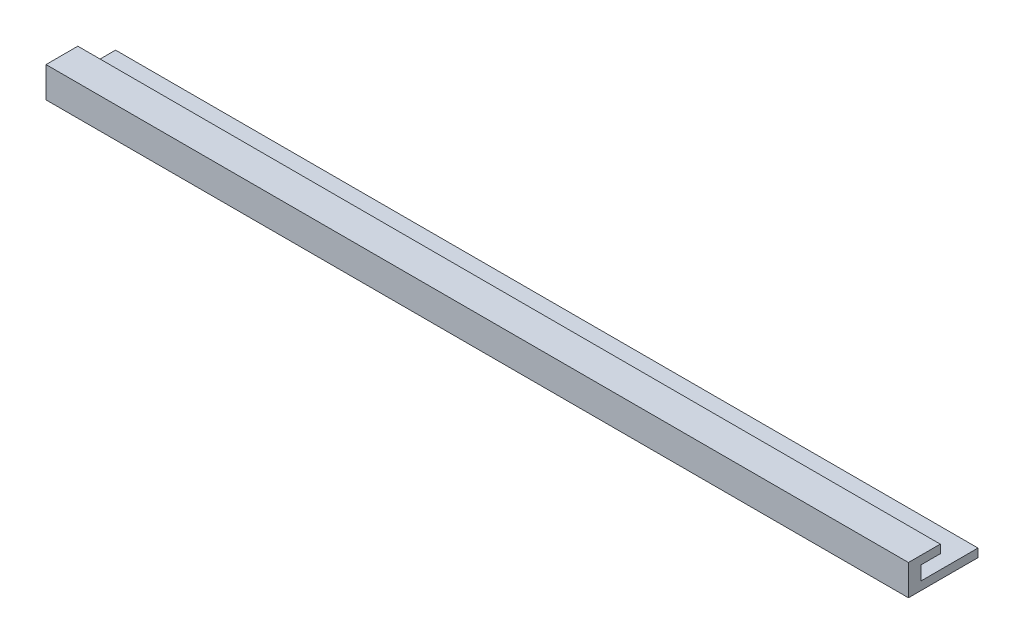
ISO-10303-21;
HEADER;
FILE_DESCRIPTION(('STEP AP214'),'2;1');
FILE_NAME('part.step','',(''),(''),'','','');
FILE_SCHEMA(('AUTOMOTIVE_DESIGN { 1 0 10303 214 1 1 1 1 }'));
ENDSEC;
DATA;
#1=APPLICATION_CONTEXT('core data for automotive mechanical design processes');
#2=APPLICATION_PROTOCOL_DEFINITION('international standard','automotive_design',2000,#1);
#3=PRODUCT_CONTEXT('',#1,'mechanical');
#4=PRODUCT('Part','Part','',(#3));
#5=PRODUCT_RELATED_PRODUCT_CATEGORY('part','',(#4));
#6=PRODUCT_DEFINITION_FORMATION('','',#4);
#7=PRODUCT_DEFINITION_CONTEXT('part definition',#1,'design');
#8=PRODUCT_DEFINITION('design','',#6,#7);
#9=PRODUCT_DEFINITION_SHAPE('','',#8);
#10=(LENGTH_UNIT() NAMED_UNIT(*) SI_UNIT(.MILLI.,.METRE.));
#11=(NAMED_UNIT(*) PLANE_ANGLE_UNIT() SI_UNIT($,.RADIAN.));
#12=(NAMED_UNIT(*) SI_UNIT($,.STERADIAN.) SOLID_ANGLE_UNIT());
#13=UNCERTAINTY_MEASURE_WITH_UNIT(LENGTH_MEASURE(1.E-05),#10,'distance_accuracy_value','');
#14=(GEOMETRIC_REPRESENTATION_CONTEXT(3) GLOBAL_UNCERTAINTY_ASSIGNED_CONTEXT((#13)) GLOBAL_UNIT_ASSIGNED_CONTEXT((#10,
#11,#12)) REPRESENTATION_CONTEXT('',''));
#15=CARTESIAN_POINT('',(0.,0.,0.));
#16=DIRECTION('',(0.,0.,1.));
#17=DIRECTION('',(1.,0.,0.));
#18=AXIS2_PLACEMENT_3D('',#15,#16,#17);
#19=CARTESIAN_POINT('',(-310.,3.,0.));
#20=DIRECTION('',(0.,1.,0.));
#21=DIRECTION('',(0.,0.,1.));
#22=AXIS2_PLACEMENT_3D('',#19,#20,#21);
#23=PLANE('',#22);
#24=DIRECTION('',(1.,0.,0.));
#25=VECTOR('',#24,1.);
#26=CARTESIAN_POINT('',(0.,3.,0.));
#27=LINE('',#26,#25);
#28=CARTESIAN_POINT('',(310.,3.,0.));
#29=VERTEX_POINT('',#28);
#30=CARTESIAN_POINT('',(-310.,3.,0.));
#31=VERTEX_POINT('',#30);
#32=EDGE_CURVE('E128',#29,#31,#27,.F.);
#33=ORIENTED_EDGE('',*,*,#32,.T.);
#34=DIRECTION('',(0.,0.,1.));
#35=VECTOR('',#34,1.);
#36=CARTESIAN_POINT('',(-310.,3.,0.));
#37=LINE('',#36,#35);
#38=CARTESIAN_POINT('',(-310.,3.,41.));
#39=VERTEX_POINT('',#38);
#40=EDGE_CURVE('E127',#39,#31,#37,.F.);
#41=ORIENTED_EDGE('',*,*,#40,.F.);
#42=DIRECTION('',(-1.,0.,0.));
#43=VECTOR('',#42,1.);
#44=CARTESIAN_POINT('',(0.,3.,41.));
#45=LINE('',#44,#43);
#46=CARTESIAN_POINT('',(310.,3.,41.));
#47=VERTEX_POINT('',#46);
#48=EDGE_CURVE('E20',#47,#39,#45,.T.);
#49=ORIENTED_EDGE('',*,*,#48,.F.);
#50=DIRECTION('',(0.,0.,-1.));
#51=VECTOR('',#50,1.);
#52=CARTESIAN_POINT('',(310.,3.,0.));
#53=LINE('',#52,#51);
#54=EDGE_CURVE('E246',#29,#47,#53,.F.);
#55=ORIENTED_EDGE('',*,*,#54,.F.);
#56=EDGE_LOOP('',(#33,#41,#49,#55));
#57=FACE_BOUND('',#56,.T.);
#58=ADVANCED_FACE('F17',(#57),#23,.T.);
#59=CARTESIAN_POINT('',(0.,13.,41.));
#60=DIRECTION('',(0.,0.,-1.));
#61=DIRECTION('',(-1.,0.,0.));
#62=AXIS2_PLACEMENT_3D('',#59,#60,#61);
#63=PLANE('',#62);
#64=DIRECTION('',(0.,1.,0.));
#65=VECTOR('',#64,1.);
#66=CARTESIAN_POINT('',(-310.,-3.,41.));
#67=LINE('',#66,#65);
#68=CARTESIAN_POINT('',(-310.,13.,41.));
#69=VERTEX_POINT('',#68);
#70=EDGE_CURVE('E119',#69,#39,#67,.F.);
#71=ORIENTED_EDGE('',*,*,#70,.F.);
#72=DIRECTION('',(1.,0.,0.));
#73=VECTOR('',#72,1.);
#74=CARTESIAN_POINT('',(0.,13.,41.));
#75=LINE('',#74,#73);
#76=CARTESIAN_POINT('',(310.,13.,41.));
#77=VERTEX_POINT('',#76);
#78=EDGE_CURVE('E109',#77,#69,#75,.F.);
#79=ORIENTED_EDGE('',*,*,#78,.F.);
#80=DIRECTION('',(0.,1.,0.));
#81=VECTOR('',#80,1.);
#82=CARTESIAN_POINT('',(310.,3.,41.));
#83=LINE('',#82,#81);
#84=EDGE_CURVE('E122',#47,#77,#83,.T.);
#85=ORIENTED_EDGE('',*,*,#84,.F.);
#86=ORIENTED_EDGE('',*,*,#48,.T.);
#87=EDGE_LOOP('',(#71,#79,#85,#86));
#88=FACE_BOUND('',#87,.T.);
#89=ADVANCED_FACE('F117',(#88),#63,.T.);
#90=CARTESIAN_POINT('',(0.,13.,27.1260670920469));
#91=DIRECTION('',(0.,-1.,0.));
#92=DIRECTION('',(0.,0.,-1.));
#93=AXIS2_PLACEMENT_3D('',#90,#91,#92);
#94=PLANE('',#93);
#95=DIRECTION('',(0.,0.,1.));
#96=VECTOR('',#95,1.);
#97=CARTESIAN_POINT('',(-310.,13.,0.));
#98=LINE('',#97,#96);
#99=CARTESIAN_POINT('',(-310.,13.,27.1260670920469));
#100=VERTEX_POINT('',#99);
#101=EDGE_CURVE('E132',#100,#69,#98,.T.);
#102=ORIENTED_EDGE('',*,*,#101,.F.);
#103=DIRECTION('',(-1.,0.,0.));
#104=VECTOR('',#103,1.);
#105=CARTESIAN_POINT('',(0.,13.,27.1260670920469));
#106=LINE('',#105,#104);
#107=CARTESIAN_POINT('',(310.,13.,27.1260670920469));
#108=VERTEX_POINT('',#107);
#109=EDGE_CURVE('E108',#108,#100,#106,.T.);
#110=ORIENTED_EDGE('',*,*,#109,.F.);
#111=DIRECTION('',(0.,0.,-1.));
#112=VECTOR('',#111,1.);
#113=CARTESIAN_POINT('',(310.,13.,0.));
#114=LINE('',#113,#112);
#115=EDGE_CURVE('E243',#77,#108,#114,.T.);
#116=ORIENTED_EDGE('',*,*,#115,.F.);
#117=ORIENTED_EDGE('',*,*,#78,.T.);
#118=EDGE_LOOP('',(#102,#110,#116,#117));
#119=FACE_BOUND('',#118,.T.);
#120=ADVANCED_FACE('F142',(#119),#94,.T.);
#121=CARTESIAN_POINT('',(0.,19.,27.1260670920469));
#122=DIRECTION('',(0.,0.,-1.));
#123=DIRECTION('',(-1.,0.,0.));
#124=AXIS2_PLACEMENT_3D('',#121,#122,#123);
#125=PLANE('',#124);
#126=DIRECTION('',(0.,1.,0.));
#127=VECTOR('',#126,1.);
#128=CARTESIAN_POINT('',(-310.,-3.,27.1260670920469));
#129=LINE('',#128,#127);
#130=CARTESIAN_POINT('',(-310.,19.,27.1260670920469));
#131=VERTEX_POINT('',#130);
#132=EDGE_CURVE('E98',#131,#100,#129,.F.);
#133=ORIENTED_EDGE('',*,*,#132,.F.);
#134=DIRECTION('',(1.,0.,0.));
#135=VECTOR('',#134,1.);
#136=CARTESIAN_POINT('',(0.,19.,27.1260670920469));
#137=LINE('',#136,#135);
#138=CARTESIAN_POINT('',(310.,19.,27.1260670920469));
#139=VERTEX_POINT('',#138);
#140=EDGE_CURVE('E79',#139,#131,#137,.F.);
#141=ORIENTED_EDGE('',*,*,#140,.F.);
#142=DIRECTION('',(0.,1.,0.));
#143=VECTOR('',#142,1.);
#144=CARTESIAN_POINT('',(310.,3.,27.1260670920469));
#145=LINE('',#144,#143);
#146=EDGE_CURVE('E140',#108,#139,#145,.T.);
#147=ORIENTED_EDGE('',*,*,#146,.F.);
#148=ORIENTED_EDGE('',*,*,#109,.T.);
#149=EDGE_LOOP('',(#133,#141,#147,#148));
#150=FACE_BOUND('',#149,.T.);
#151=ADVANCED_FACE('F137',(#150),#125,.T.);
#152=CARTESIAN_POINT('',(0.,19.,50.));
#153=DIRECTION('',(0.,1.,0.));
#154=DIRECTION('',(0.,0.,1.));
#155=AXIS2_PLACEMENT_3D('',#152,#153,#154);
#156=PLANE('',#155);
#157=DIRECTION('',(0.,0.,1.));
#158=VECTOR('',#157,1.);
#159=CARTESIAN_POINT('',(-310.,19.,0.));
#160=LINE('',#159,#158);
#161=CARTESIAN_POINT('',(-310.,19.,50.));
#162=VERTEX_POINT('',#161);
#163=EDGE_CURVE('E94',#162,#131,#160,.F.);
#164=ORIENTED_EDGE('',*,*,#163,.F.);
#165=DIRECTION('',(1.,0.,0.));
#166=VECTOR('',#165,1.);
#167=CARTESIAN_POINT('',(0.,19.,50.));
#168=LINE('',#167,#166);
#169=CARTESIAN_POINT('',(310.,19.,50.));
#170=VERTEX_POINT('',#169);
#171=EDGE_CURVE('E84',#170,#162,#168,.F.);
#172=ORIENTED_EDGE('',*,*,#171,.F.);
#173=DIRECTION('',(0.,0.,-1.));
#174=VECTOR('',#173,1.);
#175=CARTESIAN_POINT('',(310.,19.,0.));
#176=LINE('',#175,#174);
#177=EDGE_CURVE('E240',#139,#170,#176,.F.);
#178=ORIENTED_EDGE('',*,*,#177,.F.);
#179=ORIENTED_EDGE('',*,*,#140,.T.);
#180=EDGE_LOOP('',(#164,#172,#178,#179));
#181=FACE_BOUND('',#180,.T.);
#182=ADVANCED_FACE('F95',(#181),#156,.T.);
#183=CARTESIAN_POINT('',(0.,0.,50.));
#184=DIRECTION('',(0.,0.,1.));
#185=DIRECTION('',(1.,0.,0.));
#186=AXIS2_PLACEMENT_3D('',#183,#184,#185);
#187=PLANE('',#186);
#188=DIRECTION('',(0.,1.,0.));
#189=VECTOR('',#188,1.);
#190=CARTESIAN_POINT('',(-310.,-3.,50.));
#191=LINE('',#190,#189);
#192=CARTESIAN_POINT('',(-310.,-3.,50.));
#193=VERTEX_POINT('',#192);
#194=EDGE_CURVE('E87',#193,#162,#191,.T.);
#195=ORIENTED_EDGE('',*,*,#194,.F.);
#196=DIRECTION('',(1.,0.,0.));
#197=VECTOR('',#196,1.);
#198=CARTESIAN_POINT('',(310.,-3.,50.));
#199=LINE('',#198,#197);
#200=CARTESIAN_POINT('',(310.,-3.,50.));
#201=VERTEX_POINT('',#200);
#202=EDGE_CURVE('E236',#201,#193,#199,.F.);
#203=ORIENTED_EDGE('',*,*,#202,.F.);
#204=DIRECTION('',(0.,1.,0.));
#205=VECTOR('',#204,1.);
#206=CARTESIAN_POINT('',(310.,3.,50.));
#207=LINE('',#206,#205);
#208=EDGE_CURVE('E90',#170,#201,#207,.F.);
#209=ORIENTED_EDGE('',*,*,#208,.F.);
#210=ORIENTED_EDGE('',*,*,#171,.T.);
#211=EDGE_LOOP('',(#195,#203,#209,#210));
#212=FACE_BOUND('',#211,.T.);
#213=ADVANCED_FACE('F85',(#212),#187,.T.);
#214=CARTESIAN_POINT('',(-310.,-3.,0.));
#215=DIRECTION('',(-1.,0.,0.));
#216=DIRECTION('',(0.,0.,1.));
#217=AXIS2_PLACEMENT_3D('',#214,#215,#216);
#218=PLANE('',#217);
#219=DIRECTION('',(0.,1.,0.));
#220=VECTOR('',#219,1.);
#221=CARTESIAN_POINT('',(-310.,0.,0.));
#222=LINE('',#221,#220);
#223=CARTESIAN_POINT('',(-310.,-3.,0.));
#224=VERTEX_POINT('',#223);
#225=EDGE_CURVE('E130',#31,#224,#222,.F.);
#226=ORIENTED_EDGE('',*,*,#225,.T.);
#227=DIRECTION('',(0.,0.,-1.));
#228=VECTOR('',#227,1.);
#229=CARTESIAN_POINT('',(-310.,-3.,0.));
#230=LINE('',#229,#228);
#231=EDGE_CURVE('E102',#193,#224,#230,.T.);
#232=ORIENTED_EDGE('',*,*,#231,.F.);
#233=ORIENTED_EDGE('',*,*,#194,.T.);
#234=ORIENTED_EDGE('',*,*,#163,.T.);
#235=ORIENTED_EDGE('',*,*,#132,.T.);
#236=ORIENTED_EDGE('',*,*,#101,.T.);
#237=ORIENTED_EDGE('',*,*,#70,.T.);
#238=ORIENTED_EDGE('',*,*,#40,.T.);
#239=EDGE_LOOP('',(#226,#232,#233,#234,#235,#236,#237,#238));
#240=FACE_BOUND('',#239,.T.);
#241=ADVANCED_FACE('F100',(#240),#218,.T.);
#242=CARTESIAN_POINT('',(0.,0.,0.));
#243=DIRECTION('',(0.,0.,1.));
#244=DIRECTION('',(1.,0.,0.));
#245=AXIS2_PLACEMENT_3D('',#242,#243,#244);
#246=PLANE('',#245);
#247=DIRECTION('',(0.,1.,0.));
#248=VECTOR('',#247,1.);
#249=CARTESIAN_POINT('',(310.,3.,0.));
#250=LINE('',#249,#248);
#251=CARTESIAN_POINT('',(310.,-3.,0.));
#252=VERTEX_POINT('',#251);
#253=EDGE_CURVE('E35',#252,#29,#250,.T.);
#254=ORIENTED_EDGE('',*,*,#253,.F.);
#255=DIRECTION('',(1.,0.,0.));
#256=VECTOR('',#255,1.);
#257=CARTESIAN_POINT('',(310.,-3.,0.));
#258=LINE('',#257,#256);
#259=EDGE_CURVE('E26',#224,#252,#258,.T.);
#260=ORIENTED_EDGE('',*,*,#259,.F.);
#261=ORIENTED_EDGE('',*,*,#225,.F.);
#262=ORIENTED_EDGE('',*,*,#32,.F.);
#263=EDGE_LOOP('',(#254,#260,#261,#262));
#264=FACE_BOUND('',#263,.T.);
#265=ADVANCED_FACE('F159',(#264),#246,.F.);
#266=CARTESIAN_POINT('',(310.,3.,0.));
#267=DIRECTION('',(1.,0.,0.));
#268=DIRECTION('',(0.,0.,-1.));
#269=AXIS2_PLACEMENT_3D('',#266,#267,#268);
#270=PLANE('',#269);
#271=ORIENTED_EDGE('',*,*,#146,.T.);
#272=ORIENTED_EDGE('',*,*,#177,.T.);
#273=ORIENTED_EDGE('',*,*,#208,.T.);
#274=DIRECTION('',(0.,0.,-1.));
#275=VECTOR('',#274,1.);
#276=CARTESIAN_POINT('',(310.,-3.,0.));
#277=LINE('',#276,#275);
#278=EDGE_CURVE('E11',#252,#201,#277,.F.);
#279=ORIENTED_EDGE('',*,*,#278,.F.);
#280=ORIENTED_EDGE('',*,*,#253,.T.);
#281=ORIENTED_EDGE('',*,*,#54,.T.);
#282=ORIENTED_EDGE('',*,*,#84,.T.);
#283=ORIENTED_EDGE('',*,*,#115,.T.);
#284=EDGE_LOOP('',(#271,#272,#273,#279,#280,#281,#282,#283));
#285=FACE_BOUND('',#284,.T.);
#286=ADVANCED_FACE('F153',(#285),#270,.T.);
#287=CARTESIAN_POINT('',(310.,-3.,0.));
#288=DIRECTION('',(0.,-1.,0.));
#289=DIRECTION('',(0.,0.,-1.));
#290=AXIS2_PLACEMENT_3D('',#287,#288,#289);
#291=PLANE('',#290);
#292=ORIENTED_EDGE('',*,*,#259,.T.);
#293=ORIENTED_EDGE('',*,*,#278,.T.);
#294=ORIENTED_EDGE('',*,*,#202,.T.);
#295=ORIENTED_EDGE('',*,*,#231,.T.);
#296=EDGE_LOOP('',(#292,#293,#294,#295));
#297=FACE_BOUND('',#296,.T.);
#298=ADVANCED_FACE('F151',(#297),#291,.T.);
#299=CLOSED_SHELL('',(#58,#89,#120,#151,#182,#213,#241,#265,#286,#298));
#300=MANIFOLD_SOLID_BREP('B1',#299);
#301=ADVANCED_BREP_SHAPE_REPRESENTATION('',(#18,#300),#14);
#302=SHAPE_DEFINITION_REPRESENTATION(#9,#301);
ENDSEC;
END-ISO-10303-21;
